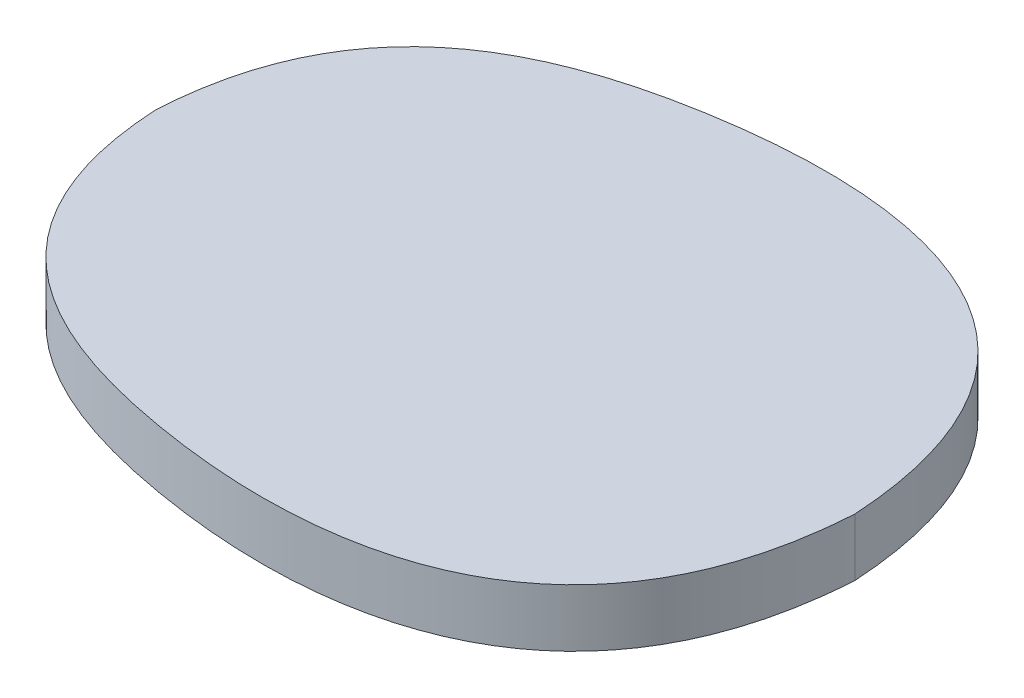
ISO-10303-21;
HEADER;
FILE_DESCRIPTION(('STEP AP214'),'2;1');
FILE_NAME('part.step','',(''),(''),'','','');
FILE_SCHEMA(('AUTOMOTIVE_DESIGN { 1 0 10303 214 1 1 1 1 }'));
ENDSEC;
DATA;
#1=APPLICATION_CONTEXT('core data for automotive mechanical design processes');
#2=APPLICATION_PROTOCOL_DEFINITION('international standard','automotive_design',2000,#1);
#3=PRODUCT_CONTEXT('',#1,'mechanical');
#4=PRODUCT('Part','Part','',(#3));
#5=PRODUCT_RELATED_PRODUCT_CATEGORY('part','',(#4));
#6=PRODUCT_DEFINITION_FORMATION('','',#4);
#7=PRODUCT_DEFINITION_CONTEXT('part definition',#1,'design');
#8=PRODUCT_DEFINITION('design','',#6,#7);
#9=PRODUCT_DEFINITION_SHAPE('','',#8);
#10=(LENGTH_UNIT() NAMED_UNIT(*) SI_UNIT(.MILLI.,.METRE.));
#11=(NAMED_UNIT(*) PLANE_ANGLE_UNIT() SI_UNIT($,.RADIAN.));
#12=(NAMED_UNIT(*) SI_UNIT($,.STERADIAN.) SOLID_ANGLE_UNIT());
#13=UNCERTAINTY_MEASURE_WITH_UNIT(LENGTH_MEASURE(1.E-05),#10,'distance_accuracy_value','');
#14=(GEOMETRIC_REPRESENTATION_CONTEXT(3) GLOBAL_UNCERTAINTY_ASSIGNED_CONTEXT((#13)) GLOBAL_UNIT_ASSIGNED_CONTEXT((#10,
#11,#12)) REPRESENTATION_CONTEXT('',''));
#15=CARTESIAN_POINT('',(0.,0.,0.));
#16=DIRECTION('',(0.,0.,1.));
#17=DIRECTION('',(1.,0.,0.));
#18=AXIS2_PLACEMENT_3D('',#15,#16,#17);
#19=CARTESIAN_POINT('',(-50.8406000956953,10.,0.));
#20=CARTESIAN_POINT('',(-49.0750634933923,10.,32.4071382255581));
#21=CARTESIAN_POINT('',(2.4741278276314,10.,57.3577685232578));
#22=CARTESIAN_POINT('',(67.7071895703975,10.,46.9007438565674));
#23=CARTESIAN_POINT('',(70.5273793742679,10.,0.));
#24=B_SPLINE_CURVE_WITH_KNOTS('',3,(#19,#20,#21,#22,#23),.UNSPECIFIED.,.F.,.F.,(4,1,4),(0.,
0.418325647040048,1.),.UNSPECIFIED.);
#25=DIRECTION('',(0.,-1.,0.));
#26=VECTOR('',#25,1.);
#27=SURFACE_OF_LINEAR_EXTRUSION('',#24,#26);
#28=CARTESIAN_POINT('',(-50.8406000956953,0.,0.));
#29=CARTESIAN_POINT('',(-49.0750634933923,0.,32.4071382255581));
#30=CARTESIAN_POINT('',(2.4741278276314,0.,57.3577685232578));
#31=CARTESIAN_POINT('',(67.7071895703975,0.,46.9007438565674));
#32=CARTESIAN_POINT('',(70.5273793742679,0.,0.));
#33=B_SPLINE_CURVE_WITH_KNOTS('',3,(#28,#29,#30,#31,#32),.UNSPECIFIED.,.F.,.F.,(4,1,4),(0.,
0.418325647040048,1.),.UNSPECIFIED.);
#34=CARTESIAN_POINT('',(-50.8406000956953,0.,0.));
#35=VERTEX_POINT('',#34);
#36=CARTESIAN_POINT('',(70.5273793742679,0.,0.));
#37=VERTEX_POINT('',#36);
#38=EDGE_CURVE('E63',#35,#37,#33,.T.);
#39=ORIENTED_EDGE('',*,*,#38,.T.);
#40=DIRECTION('',(0.,-1.,0.));
#41=VECTOR('',#40,1.);
#42=CARTESIAN_POINT('',(70.5273793742679,10.,0.));
#43=LINE('',#42,#41);
#44=CARTESIAN_POINT('',(70.5273793742679,10.,0.));
#45=VERTEX_POINT('',#44);
#46=EDGE_CURVE('E11',#45,#37,#43,.T.);
#47=ORIENTED_EDGE('',*,*,#46,.F.);
#48=CARTESIAN_POINT('',(-50.8406000956953,10.,0.));
#49=VERTEX_POINT('',#48);
#50=EDGE_CURVE('E62',#49,#45,#24,.T.);
#51=ORIENTED_EDGE('',*,*,#50,.F.);
#52=DIRECTION('',(0.,-1.,0.));
#53=VECTOR('',#52,1.);
#54=CARTESIAN_POINT('',(-50.8406000956953,10.,0.));
#55=LINE('',#54,#53);
#56=EDGE_CURVE('E40',#49,#35,#55,.T.);
#57=ORIENTED_EDGE('',*,*,#56,.T.);
#58=EDGE_LOOP('',(#39,#47,#51,#57));
#59=FACE_BOUND('',#58,.T.);
#60=ADVANCED_FACE('F31',(#59),#27,.F.);
#61=CARTESIAN_POINT('',(70.5273793742679,10.,0.));
#62=CARTESIAN_POINT('',(67.7071895703975,10.,-46.9007438565674));
#63=CARTESIAN_POINT('',(2.4741278276314,10.,-57.3577685232577));
#64=CARTESIAN_POINT('',(-49.0750634933923,10.,-32.4071382255581));
#65=CARTESIAN_POINT('',(-50.8406000956953,10.,0.));
#66=B_SPLINE_CURVE_WITH_KNOTS('',3,(#61,#62,#63,#64,#65),.UNSPECIFIED.,.F.,.F.,(4,1,4),(0.,
0.581674352959952,1.),.UNSPECIFIED.);
#67=DIRECTION('',(0.,-1.,0.));
#68=VECTOR('',#67,1.);
#69=SURFACE_OF_LINEAR_EXTRUSION('',#66,#68);
#70=CARTESIAN_POINT('',(70.5273793742679,0.,0.));
#71=CARTESIAN_POINT('',(67.7071895703975,0.,-46.9007438565674));
#72=CARTESIAN_POINT('',(2.4741278276314,0.,-57.3577685232577));
#73=CARTESIAN_POINT('',(-49.0750634933923,0.,-32.4071382255581));
#74=CARTESIAN_POINT('',(-50.8406000956953,0.,0.));
#75=B_SPLINE_CURVE_WITH_KNOTS('',3,(#70,#71,#72,#73,#74),.UNSPECIFIED.,.F.,.F.,(4,1,4),(0.,
0.581674352959952,1.),.UNSPECIFIED.);
#76=EDGE_CURVE('E55',#37,#35,#75,.T.);
#77=ORIENTED_EDGE('',*,*,#76,.T.);
#78=ORIENTED_EDGE('',*,*,#56,.F.);
#79=EDGE_CURVE('E47',#45,#49,#66,.T.);
#80=ORIENTED_EDGE('',*,*,#79,.F.);
#81=ORIENTED_EDGE('',*,*,#46,.T.);
#82=EDGE_LOOP('',(#77,#78,#80,#81));
#83=FACE_BOUND('',#82,.T.);
#84=ADVANCED_FACE('F58',(#83),#69,.F.);
#85=CARTESIAN_POINT('',(10.6453816211153,10.,48.7817054309275));
#86=DIRECTION('',(0.,-1.,0.));
#87=DIRECTION('',(0.,0.,-1.));
#88=AXIS2_PLACEMENT_3D('',#85,#86,#87);
#89=PLANE('',#88);
#90=ORIENTED_EDGE('',*,*,#50,.T.);
#91=ORIENTED_EDGE('',*,*,#79,.T.);
#92=EDGE_LOOP('',(#90,#91));
#93=FACE_BOUND('',#92,.T.);
#94=ADVANCED_FACE('F90',(#93),#89,.F.);
#95=CARTESIAN_POINT('',(10.6453816211153,0.,48.7817054309275));
#96=DIRECTION('',(0.,-1.,0.));
#97=DIRECTION('',(0.,0.,-1.));
#98=AXIS2_PLACEMENT_3D('',#95,#96,#97);
#99=PLANE('',#98);
#100=ORIENTED_EDGE('',*,*,#38,.F.);
#101=ORIENTED_EDGE('',*,*,#76,.F.);
#102=EDGE_LOOP('',(#100,#101));
#103=FACE_BOUND('',#102,.T.);
#104=ADVANCED_FACE('F66',(#103),#99,.T.);
#105=CLOSED_SHELL('',(#60,#84,#94,#104));
#106=MANIFOLD_SOLID_BREP('B2',#105);
#107=ADVANCED_BREP_SHAPE_REPRESENTATION('',(#18,#106),#14);
#108=SHAPE_DEFINITION_REPRESENTATION(#9,#107);
ENDSEC;
END-ISO-10303-21;
